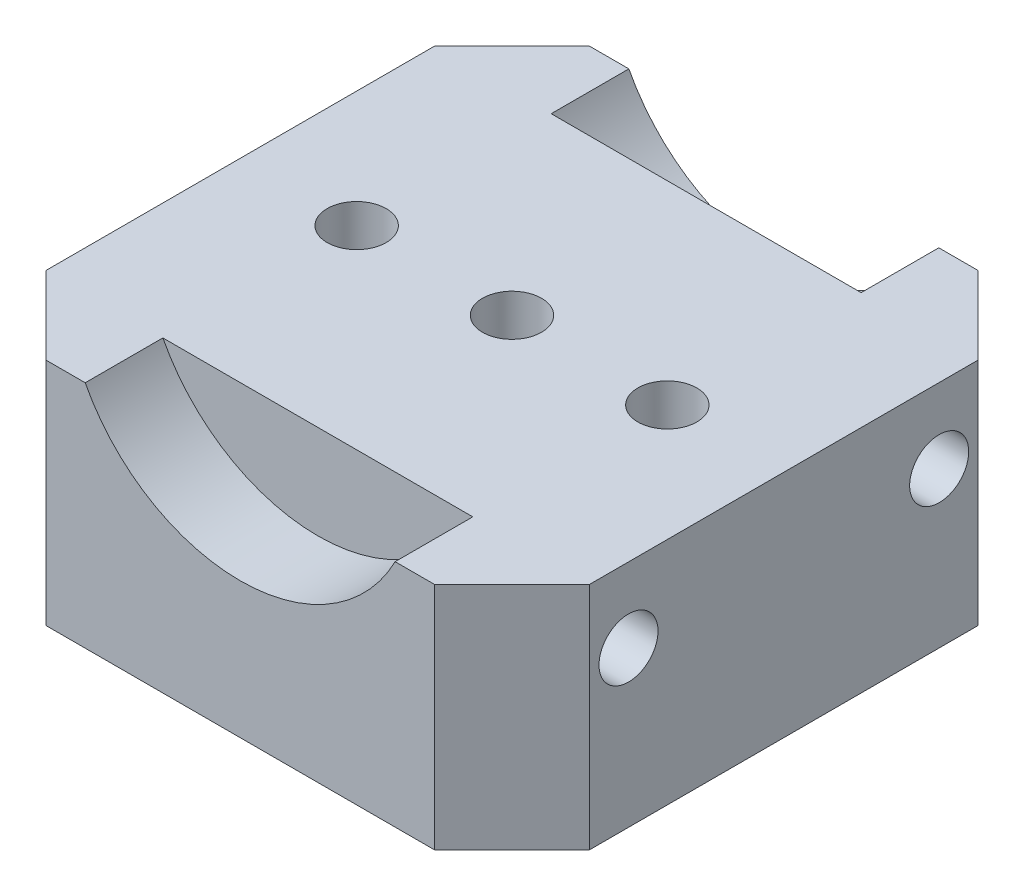
ISO-10303-21;
HEADER;
FILE_DESCRIPTION(('STEP AP214'),'2;1');
FILE_NAME('part.step','',(''),(''),'','','');
FILE_SCHEMA(('AUTOMOTIVE_DESIGN { 1 0 10303 214 1 1 1 1 }'));
ENDSEC;
DATA;
#1=APPLICATION_CONTEXT('core data for automotive mechanical design processes');
#2=APPLICATION_PROTOCOL_DEFINITION('international standard','automotive_design',2000,#1);
#3=PRODUCT_CONTEXT('',#1,'mechanical');
#4=PRODUCT('Part','Part','',(#3));
#5=PRODUCT_RELATED_PRODUCT_CATEGORY('part','',(#4));
#6=PRODUCT_DEFINITION_FORMATION('','',#4);
#7=PRODUCT_DEFINITION_CONTEXT('part definition',#1,'design');
#8=PRODUCT_DEFINITION('design','',#6,#7);
#9=PRODUCT_DEFINITION_SHAPE('','',#8);
#10=(LENGTH_UNIT() NAMED_UNIT(*) SI_UNIT(.MILLI.,.METRE.));
#11=(NAMED_UNIT(*) PLANE_ANGLE_UNIT() SI_UNIT($,.RADIAN.));
#12=(NAMED_UNIT(*) SI_UNIT($,.STERADIAN.) SOLID_ANGLE_UNIT());
#13=UNCERTAINTY_MEASURE_WITH_UNIT(LENGTH_MEASURE(1.E-05),#10,'distance_accuracy_value','');
#14=(GEOMETRIC_REPRESENTATION_CONTEXT(3) GLOBAL_UNCERTAINTY_ASSIGNED_CONTEXT((#13)) GLOBAL_UNIT_ASSIGNED_CONTEXT((#10,
#11,#12)) REPRESENTATION_CONTEXT('',''));
#15=CARTESIAN_POINT('',(0.,0.,0.));
#16=DIRECTION('',(0.,0.,1.));
#17=DIRECTION('',(1.,0.,0.));
#18=AXIS2_PLACEMENT_3D('',#15,#16,#17);
#19=CARTESIAN_POINT('',(0.,18.796,0.));
#20=DIRECTION('',(0.,-1.,0.));
#21=DIRECTION('',(0.,0.,-1.));
#22=AXIS2_PLACEMENT_3D('',#19,#20,#21);
#23=PLANE('',#22);
#24=CARTESIAN_POINT('',(34.925,18.796,-22.225));
#25=DIRECTION('',(0.,-1.,0.));
#26=DIRECTION('',(0.,0.,-1.));
#27=AXIS2_PLACEMENT_3D('',#24,#25,#26);
#28=CIRCLE('',#27,2.413);
#29=CARTESIAN_POINT('',(34.925,18.796,-24.638));
#30=VERTEX_POINT('',#29);
#31=EDGE_CURVE('E152',#30,#30,#28,.T.);
#32=ORIENTED_EDGE('',*,*,#31,.T.);
#33=EDGE_LOOP('',(#32));
#34=FACE_BOUND('',#33,.T.);
#35=CARTESIAN_POINT('',(22.225,18.796,-22.225));
#36=DIRECTION('',(0.,-1.,0.));
#37=DIRECTION('',(0.,0.,-1.));
#38=AXIS2_PLACEMENT_3D('',#35,#36,#37);
#39=CIRCLE('',#38,2.413);
#40=CARTESIAN_POINT('',(22.225,18.796,-24.638));
#41=VERTEX_POINT('',#40);
#42=EDGE_CURVE('E158',#41,#41,#39,.T.);
#43=ORIENTED_EDGE('',*,*,#42,.T.);
#44=EDGE_LOOP('',(#43));
#45=FACE_BOUND('',#44,.T.);
#46=CARTESIAN_POINT('',(9.525,18.796,-22.225));
#47=DIRECTION('',(0.,-1.,0.));
#48=DIRECTION('',(0.,0.,-1.));
#49=AXIS2_PLACEMENT_3D('',#46,#47,#48);
#50=CIRCLE('',#49,2.413);
#51=CARTESIAN_POINT('',(9.525,18.796,-24.638));
#52=VERTEX_POINT('',#51);
#53=EDGE_CURVE('E172',#52,#52,#50,.T.);
#54=ORIENTED_EDGE('',*,*,#53,.T.);
#55=EDGE_LOOP('',(#54));
#56=FACE_BOUND('',#55,.T.);
#57=DIRECTION('',(0.,0.,-1.));
#58=VECTOR('',#57,1.);
#59=CARTESIAN_POINT('',(9.55535753266888,18.796,-38.1));
#60=LINE('',#59,#58);
#61=CARTESIAN_POINT('',(9.55535753266888,18.796,-44.45));
#62=VERTEX_POINT('',#61);
#63=CARTESIAN_POINT('',(9.55535753266888,18.796,-38.1));
#64=VERTEX_POINT('',#63);
#65=EDGE_CURVE('E11',#62,#64,#60,.F.);
#66=ORIENTED_EDGE('',*,*,#65,.F.);
#67=DIRECTION('',(1.,0.,0.));
#68=VECTOR('',#67,1.);
#69=CARTESIAN_POINT('',(0.,18.796,-44.45));
#70=LINE('',#69,#68);
#71=CARTESIAN_POINT('',(6.35,18.796,-44.45));
#72=VERTEX_POINT('',#71);
#73=EDGE_CURVE('E144',#72,#62,#70,.T.);
#74=ORIENTED_EDGE('',*,*,#73,.F.);
#75=DIRECTION('',(0.707106781186547,0.,-0.707106781186548));
#76=VECTOR('',#75,1.);
#77=CARTESIAN_POINT('',(0.,18.796,-38.1));
#78=LINE('',#77,#76);
#79=CARTESIAN_POINT('',(0.,18.796,-38.1));
#80=VERTEX_POINT('',#79);
#81=EDGE_CURVE('E176',#80,#72,#78,.T.);
#82=ORIENTED_EDGE('',*,*,#81,.F.);
#83=DIRECTION('',(0.,0.,-1.));
#84=VECTOR('',#83,1.);
#85=CARTESIAN_POINT('',(0.,18.796,0.));
#86=LINE('',#85,#84);
#87=CARTESIAN_POINT('',(0.,18.796,-6.35));
#88=VERTEX_POINT('',#87);
#89=EDGE_CURVE('E308',#88,#80,#86,.T.);
#90=ORIENTED_EDGE('',*,*,#89,.F.);
#91=DIRECTION('',(-0.707106781186548,0.,-0.707106781186548));
#92=VECTOR('',#91,1.);
#93=CARTESIAN_POINT('',(0.,18.796,-6.35));
#94=LINE('',#93,#92);
#95=CARTESIAN_POINT('',(6.35,18.796,0.));
#96=VERTEX_POINT('',#95);
#97=EDGE_CURVE('E187',#96,#88,#94,.T.);
#98=ORIENTED_EDGE('',*,*,#97,.F.);
#99=DIRECTION('',(1.,0.,0.));
#100=VECTOR('',#99,1.);
#101=CARTESIAN_POINT('',(0.,18.796,0.));
#102=LINE('',#101,#100);
#103=CARTESIAN_POINT('',(9.55535753266888,18.796,0.));
#104=VERTEX_POINT('',#103);
#105=EDGE_CURVE('E160',#96,#104,#102,.T.);
#106=ORIENTED_EDGE('',*,*,#105,.T.);
#107=DIRECTION('',(0.,0.,1.));
#108=VECTOR('',#107,1.);
#109=CARTESIAN_POINT('',(9.55535753266888,18.796,-6.35));
#110=LINE('',#109,#108);
#111=CARTESIAN_POINT('',(9.55535753266888,18.796,-6.35));
#112=VERTEX_POINT('',#111);
#113=EDGE_CURVE('E276',#104,#112,#110,.F.);
#114=ORIENTED_EDGE('',*,*,#113,.T.);
#115=DIRECTION('',(-1.,0.,0.));
#116=VECTOR('',#115,1.);
#117=CARTESIAN_POINT('',(0.,18.796,-6.35));
#118=LINE('',#117,#116);
#119=CARTESIAN_POINT('',(34.8946424673311,18.796,-6.35));
#120=VERTEX_POINT('',#119);
#121=EDGE_CURVE('E272',#120,#112,#118,.T.);
#122=ORIENTED_EDGE('',*,*,#121,.F.);
#123=DIRECTION('',(0.,0.,1.));
#124=VECTOR('',#123,1.);
#125=CARTESIAN_POINT('',(34.8946424673311,18.796,-6.35));
#126=LINE('',#125,#124);
#127=CARTESIAN_POINT('',(34.8946424673311,18.796,0.));
#128=VERTEX_POINT('',#127);
#129=EDGE_CURVE('E280',#120,#128,#126,.T.);
#130=ORIENTED_EDGE('',*,*,#129,.T.);
#131=CARTESIAN_POINT('',(38.1,18.796,0.));
#132=VERTEX_POINT('',#131);
#133=EDGE_CURVE('E168',#128,#132,#102,.T.);
#134=ORIENTED_EDGE('',*,*,#133,.T.);
#135=DIRECTION('',(-0.707106781186548,0.,0.707106781186547));
#136=VECTOR('',#135,1.);
#137=CARTESIAN_POINT('',(38.1,18.796,0.));
#138=LINE('',#137,#136);
#139=CARTESIAN_POINT('',(44.45,18.796,-6.35));
#140=VERTEX_POINT('',#139);
#141=EDGE_CURVE('E183',#140,#132,#138,.T.);
#142=ORIENTED_EDGE('',*,*,#141,.F.);
#143=DIRECTION('',(0.,0.,-1.));
#144=VECTOR('',#143,1.);
#145=CARTESIAN_POINT('',(44.45,18.796,0.));
#146=LINE('',#145,#144);
#147=CARTESIAN_POINT('',(44.45,18.796,-38.1));
#148=VERTEX_POINT('',#147);
#149=EDGE_CURVE('E163',#140,#148,#146,.T.);
#150=ORIENTED_EDGE('',*,*,#149,.T.);
#151=DIRECTION('',(0.707106781186548,0.,0.707106781186548));
#152=VECTOR('',#151,1.);
#153=CARTESIAN_POINT('',(38.1,18.796,-44.45));
#154=LINE('',#153,#152);
#155=CARTESIAN_POINT('',(38.1,18.796,-44.45));
#156=VERTEX_POINT('',#155);
#157=EDGE_CURVE('E179',#156,#148,#154,.T.);
#158=ORIENTED_EDGE('',*,*,#157,.F.);
#159=CARTESIAN_POINT('',(34.8946424673311,18.796,-44.45));
#160=VERTEX_POINT('',#159);
#161=EDGE_CURVE('E153',#160,#156,#70,.T.);
#162=ORIENTED_EDGE('',*,*,#161,.F.);
#163=DIRECTION('',(0.,0.,-1.));
#164=VECTOR('',#163,1.);
#165=CARTESIAN_POINT('',(34.8946424673311,18.796,-38.1));
#166=LINE('',#165,#164);
#167=CARTESIAN_POINT('',(34.8946424673311,18.796,-38.1));
#168=VERTEX_POINT('',#167);
#169=EDGE_CURVE('E54',#168,#160,#166,.T.);
#170=ORIENTED_EDGE('',*,*,#169,.F.);
#171=DIRECTION('',(1.,0.,0.));
#172=VECTOR('',#171,1.);
#173=CARTESIAN_POINT('',(0.,18.796,-38.1));
#174=LINE('',#173,#172);
#175=EDGE_CURVE('E146',#64,#168,#174,.T.);
#176=ORIENTED_EDGE('',*,*,#175,.F.);
#177=EDGE_LOOP('',(#66,#74,#82,#90,#98,#106,#114,#122,#130,#134,#142,#150,#158,#162,#170,#176));
#178=FACE_BOUND('',#177,.T.);
#179=ADVANCED_FACE('F45',(#34,#45,#56,#178),#23,.F.);
#180=CARTESIAN_POINT('',(0.,0.,0.));
#181=DIRECTION('',(0.,-1.,0.));
#182=DIRECTION('',(0.,0.,-1.));
#183=AXIS2_PLACEMENT_3D('',#180,#181,#182);
#184=PLANE('',#183);
#185=CARTESIAN_POINT('',(22.225,0.,-22.225));
#186=DIRECTION('',(0.,1.,0.));
#187=DIRECTION('',(0.,0.,1.));
#188=AXIS2_PLACEMENT_3D('',#185,#186,#187);
#189=CIRCLE('',#188,2.413);
#190=CARTESIAN_POINT('',(22.225,0.,-19.812));
#191=VERTEX_POINT('',#190);
#192=EDGE_CURVE('E211',#191,#191,#189,.T.);
#193=ORIENTED_EDGE('',*,*,#192,.T.);
#194=EDGE_LOOP('',(#193));
#195=FACE_BOUND('',#194,.T.);
#196=DIRECTION('',(0.,0.,1.));
#197=VECTOR('',#196,1.);
#198=CARTESIAN_POINT('',(0.,0.,-6.35));
#199=LINE('',#198,#197);
#200=CARTESIAN_POINT('',(0.,0.,-38.1));
#201=VERTEX_POINT('',#200);
#202=CARTESIAN_POINT('',(0.,0.,-6.35));
#203=VERTEX_POINT('',#202);
#204=EDGE_CURVE('E219',#201,#203,#199,.T.);
#205=ORIENTED_EDGE('',*,*,#204,.F.);
#206=DIRECTION('',(-0.707106781186547,0.,0.707106781186548));
#207=VECTOR('',#206,1.);
#208=CARTESIAN_POINT('',(0.,0.,-38.1));
#209=LINE('',#208,#207);
#210=CARTESIAN_POINT('',(6.35,0.,-44.45));
#211=VERTEX_POINT('',#210);
#212=EDGE_CURVE('E246',#211,#201,#209,.T.);
#213=ORIENTED_EDGE('',*,*,#212,.F.);
#214=DIRECTION('',(-1.,0.,0.));
#215=VECTOR('',#214,1.);
#216=CARTESIAN_POINT('',(6.35,0.,-44.45));
#217=LINE('',#216,#215);
#218=CARTESIAN_POINT('',(38.1,0.,-44.45));
#219=VERTEX_POINT('',#218);
#220=EDGE_CURVE('E243',#219,#211,#217,.T.);
#221=ORIENTED_EDGE('',*,*,#220,.F.);
#222=DIRECTION('',(-0.707106781186547,0.,-0.707106781186547));
#223=VECTOR('',#222,1.);
#224=CARTESIAN_POINT('',(38.1,0.,-44.45));
#225=LINE('',#224,#223);
#226=CARTESIAN_POINT('',(44.45,0.,-38.1));
#227=VERTEX_POINT('',#226);
#228=EDGE_CURVE('E239',#227,#219,#225,.T.);
#229=ORIENTED_EDGE('',*,*,#228,.F.);
#230=DIRECTION('',(0.,0.,-1.));
#231=VECTOR('',#230,1.);
#232=CARTESIAN_POINT('',(44.45,0.,-6.35));
#233=LINE('',#232,#231);
#234=CARTESIAN_POINT('',(44.45,0.,-6.35));
#235=VERTEX_POINT('',#234);
#236=EDGE_CURVE('E235',#235,#227,#233,.T.);
#237=ORIENTED_EDGE('',*,*,#236,.F.);
#238=DIRECTION('',(0.707106781186548,0.,-0.707106781186547));
#239=VECTOR('',#238,1.);
#240=CARTESIAN_POINT('',(38.1,0.,0.));
#241=LINE('',#240,#239);
#242=CARTESIAN_POINT('',(38.1,0.,0.));
#243=VERTEX_POINT('',#242);
#244=EDGE_CURVE('E231',#243,#235,#241,.T.);
#245=ORIENTED_EDGE('',*,*,#244,.F.);
#246=DIRECTION('',(1.,0.,0.));
#247=VECTOR('',#246,1.);
#248=CARTESIAN_POINT('',(6.35,0.,0.));
#249=LINE('',#248,#247);
#250=CARTESIAN_POINT('',(6.35,0.,0.));
#251=VERTEX_POINT('',#250);
#252=EDGE_CURVE('E227',#251,#243,#249,.T.);
#253=ORIENTED_EDGE('',*,*,#252,.F.);
#254=DIRECTION('',(0.707106781186547,0.,0.707106781186547));
#255=VECTOR('',#254,1.);
#256=CARTESIAN_POINT('',(0.,0.,-6.35));
#257=LINE('',#256,#255);
#258=EDGE_CURVE('E223',#203,#251,#257,.T.);
#259=ORIENTED_EDGE('',*,*,#258,.F.);
#260=EDGE_LOOP('',(#205,#213,#221,#229,#237,#245,#253,#259));
#261=FACE_BOUND('',#260,.T.);
#262=CARTESIAN_POINT('',(9.525,0.,-22.225));
#263=DIRECTION('',(0.,1.,0.));
#264=DIRECTION('',(0.,0.,1.));
#265=AXIS2_PLACEMENT_3D('',#262,#263,#264);
#266=CIRCLE('',#265,2.413);
#267=CARTESIAN_POINT('',(9.525,0.,-19.812));
#268=VERTEX_POINT('',#267);
#269=EDGE_CURVE('E215',#268,#268,#266,.T.);
#270=ORIENTED_EDGE('',*,*,#269,.T.);
#271=EDGE_LOOP('',(#270));
#272=FACE_BOUND('',#271,.T.);
#273=CARTESIAN_POINT('',(34.925,0.,-22.225));
#274=DIRECTION('',(0.,1.,0.));
#275=DIRECTION('',(0.,0.,1.));
#276=AXIS2_PLACEMENT_3D('',#273,#274,#275);
#277=CIRCLE('',#276,2.413);
#278=CARTESIAN_POINT('',(34.925,0.,-19.812));
#279=VERTEX_POINT('',#278);
#280=EDGE_CURVE('E207',#279,#279,#277,.T.);
#281=ORIENTED_EDGE('',*,*,#280,.T.);
#282=EDGE_LOOP('',(#281));
#283=FACE_BOUND('',#282,.T.);
#284=ADVANCED_FACE('F301',(#195,#261,#272,#283),#184,.T.);
#285=CARTESIAN_POINT('',(0.,44.45,-6.35));
#286=DIRECTION('',(1.,0.,0.));
#287=DIRECTION('',(0.,0.,-1.));
#288=AXIS2_PLACEMENT_3D('',#285,#286,#287);
#289=PLANE('',#288);
#290=CARTESIAN_POINT('',(0.,12.7,-9.525));
#291=DIRECTION('',(1.,0.,0.));
#292=DIRECTION('',(0.,0.,-1.));
#293=AXIS2_PLACEMENT_3D('',#290,#291,#292);
#294=CIRCLE('',#293,2.413);
#295=CARTESIAN_POINT('',(0.,12.7,-11.938));
#296=VERTEX_POINT('',#295);
#297=EDGE_CURVE('E203',#296,#296,#294,.T.);
#298=ORIENTED_EDGE('',*,*,#297,.T.);
#299=EDGE_LOOP('',(#298));
#300=FACE_BOUND('',#299,.T.);
#301=CARTESIAN_POINT('',(0.,12.7,-34.925));
#302=DIRECTION('',(1.,0.,0.));
#303=DIRECTION('',(0.,0.,-1.));
#304=AXIS2_PLACEMENT_3D('',#301,#302,#303);
#305=CIRCLE('',#304,2.413);
#306=CARTESIAN_POINT('',(0.,12.7,-37.338));
#307=VERTEX_POINT('',#306);
#308=EDGE_CURVE('E196',#307,#307,#305,.T.);
#309=ORIENTED_EDGE('',*,*,#308,.T.);
#310=EDGE_LOOP('',(#309));
#311=FACE_BOUND('',#310,.T.);
#312=DIRECTION('',(0.,-1.,0.));
#313=VECTOR('',#312,1.);
#314=CARTESIAN_POINT('',(0.,44.45,-6.35));
#315=LINE('',#314,#313);
#316=EDGE_CURVE('E270',#88,#203,#315,.T.);
#317=ORIENTED_EDGE('',*,*,#316,.F.);
#318=ORIENTED_EDGE('',*,*,#89,.T.);
#319=DIRECTION('',(0.,-1.,0.));
#320=VECTOR('',#319,1.);
#321=CARTESIAN_POINT('',(0.,44.45,-38.1));
#322=LINE('',#321,#320);
#323=EDGE_CURVE('E250',#80,#201,#322,.T.);
#324=ORIENTED_EDGE('',*,*,#323,.T.);
#325=ORIENTED_EDGE('',*,*,#204,.T.);
#326=EDGE_LOOP('',(#317,#318,#324,#325));
#327=FACE_BOUND('',#326,.T.);
#328=ADVANCED_FACE('F47',(#300,#311,#327),#289,.F.);
#329=CARTESIAN_POINT('',(0.,44.45,-6.35));
#330=DIRECTION('',(0.707106781186547,0.,-0.707106781186547));
#331=DIRECTION('',(-0.707106781186548,0.,-0.707106781186548));
#332=AXIS2_PLACEMENT_3D('',#329,#330,#331);
#333=PLANE('',#332);
#334=DIRECTION('',(0.,-1.,0.));
#335=VECTOR('',#334,1.);
#336=CARTESIAN_POINT('',(6.35,44.45,0.));
#337=LINE('',#336,#335);
#338=EDGE_CURVE('E267',#96,#251,#337,.T.);
#339=ORIENTED_EDGE('',*,*,#338,.F.);
#340=ORIENTED_EDGE('',*,*,#97,.T.);
#341=ORIENTED_EDGE('',*,*,#316,.T.);
#342=ORIENTED_EDGE('',*,*,#258,.T.);
#343=EDGE_LOOP('',(#339,#340,#341,#342));
#344=FACE_BOUND('',#343,.T.);
#345=ADVANCED_FACE('F337',(#344),#333,.F.);
#346=CARTESIAN_POINT('',(6.35,44.45,0.));
#347=DIRECTION('',(0.,0.,-1.));
#348=DIRECTION('',(-1.,0.,0.));
#349=AXIS2_PLACEMENT_3D('',#346,#347,#348);
#350=PLANE('',#349);
#351=ORIENTED_EDGE('',*,*,#133,.F.);
#352=CARTESIAN_POINT('',(22.225,25.4,0.));
#353=DIRECTION('',(0.,0.,1.));
#354=DIRECTION('',(1.,0.,0.));
#355=AXIS2_PLACEMENT_3D('',#352,#353,#354);
#356=CIRCLE('',#355,14.2875);
#357=EDGE_CURVE('E288',#104,#128,#356,.T.);
#358=ORIENTED_EDGE('',*,*,#357,.F.);
#359=ORIENTED_EDGE('',*,*,#105,.F.);
#360=ORIENTED_EDGE('',*,*,#338,.T.);
#361=ORIENTED_EDGE('',*,*,#252,.T.);
#362=DIRECTION('',(0.,-1.,0.));
#363=VECTOR('',#362,1.);
#364=CARTESIAN_POINT('',(38.1,44.45,0.));
#365=LINE('',#364,#363);
#366=EDGE_CURVE('E264',#132,#243,#365,.T.);
#367=ORIENTED_EDGE('',*,*,#366,.F.);
#368=EDGE_LOOP('',(#351,#358,#359,#360,#361,#367));
#369=FACE_BOUND('',#368,.T.);
#370=ADVANCED_FACE('F326',(#369),#350,.F.);
#371=CARTESIAN_POINT('',(38.1,44.45,0.));
#372=DIRECTION('',(-0.707106781186547,0.,-0.707106781186548));
#373=DIRECTION('',(-0.707106781186548,0.,0.707106781186547));
#374=AXIS2_PLACEMENT_3D('',#371,#372,#373);
#375=PLANE('',#374);
#376=DIRECTION('',(0.,-1.,0.));
#377=VECTOR('',#376,1.);
#378=CARTESIAN_POINT('',(44.45,44.45,-6.35));
#379=LINE('',#378,#377);
#380=EDGE_CURVE('E261',#140,#235,#379,.T.);
#381=ORIENTED_EDGE('',*,*,#380,.F.);
#382=ORIENTED_EDGE('',*,*,#141,.T.);
#383=ORIENTED_EDGE('',*,*,#366,.T.);
#384=ORIENTED_EDGE('',*,*,#244,.T.);
#385=EDGE_LOOP('',(#381,#382,#383,#384));
#386=FACE_BOUND('',#385,.T.);
#387=ADVANCED_FACE('F331',(#386),#375,.F.);
#388=CARTESIAN_POINT('',(44.45,44.45,-6.35));
#389=DIRECTION('',(-1.,0.,0.));
#390=DIRECTION('',(0.,0.,1.));
#391=AXIS2_PLACEMENT_3D('',#388,#389,#390);
#392=PLANE('',#391);
#393=CARTESIAN_POINT('',(44.45,12.7,-9.525));
#394=DIRECTION('',(1.,0.,0.));
#395=DIRECTION('',(0.,0.,-1.));
#396=AXIS2_PLACEMENT_3D('',#393,#394,#395);
#397=CIRCLE('',#396,2.413);
#398=CARTESIAN_POINT('',(44.45,12.7,-11.938));
#399=VERTEX_POINT('',#398);
#400=EDGE_CURVE('E191',#399,#399,#397,.T.);
#401=ORIENTED_EDGE('',*,*,#400,.F.);
#402=EDGE_LOOP('',(#401));
#403=FACE_BOUND('',#402,.T.);
#404=CARTESIAN_POINT('',(44.45,12.7,-34.925));
#405=DIRECTION('',(1.,0.,0.));
#406=DIRECTION('',(0.,0.,-1.));
#407=AXIS2_PLACEMENT_3D('',#404,#405,#406);
#408=CIRCLE('',#407,2.413);
#409=CARTESIAN_POINT('',(44.45,12.7,-37.338));
#410=VERTEX_POINT('',#409);
#411=EDGE_CURVE('E192',#410,#410,#408,.T.);
#412=ORIENTED_EDGE('',*,*,#411,.F.);
#413=EDGE_LOOP('',(#412));
#414=FACE_BOUND('',#413,.T.);
#415=DIRECTION('',(0.,-1.,0.));
#416=VECTOR('',#415,1.);
#417=CARTESIAN_POINT('',(44.45,44.45,-38.1));
#418=LINE('',#417,#416);
#419=EDGE_CURVE('E258',#148,#227,#418,.T.);
#420=ORIENTED_EDGE('',*,*,#419,.F.);
#421=ORIENTED_EDGE('',*,*,#149,.F.);
#422=ORIENTED_EDGE('',*,*,#380,.T.);
#423=ORIENTED_EDGE('',*,*,#236,.T.);
#424=EDGE_LOOP('',(#420,#421,#422,#423));
#425=FACE_BOUND('',#424,.T.);
#426=ADVANCED_FACE('F334',(#403,#414,#425),#392,.F.);
#427=CARTESIAN_POINT('',(38.1,44.45,-44.45));
#428=DIRECTION('',(-0.707106781186547,0.,0.707106781186547));
#429=DIRECTION('',(0.707106781186548,0.,0.707106781186548));
#430=AXIS2_PLACEMENT_3D('',#427,#428,#429);
#431=PLANE('',#430);
#432=DIRECTION('',(0.,-1.,0.));
#433=VECTOR('',#432,1.);
#434=CARTESIAN_POINT('',(38.1,44.45,-44.45));
#435=LINE('',#434,#433);
#436=EDGE_CURVE('E255',#156,#219,#435,.T.);
#437=ORIENTED_EDGE('',*,*,#436,.F.);
#438=ORIENTED_EDGE('',*,*,#157,.T.);
#439=ORIENTED_EDGE('',*,*,#419,.T.);
#440=ORIENTED_EDGE('',*,*,#228,.T.);
#441=EDGE_LOOP('',(#437,#438,#439,#440));
#442=FACE_BOUND('',#441,.T.);
#443=ADVANCED_FACE('F296',(#442),#431,.F.);
#444=CARTESIAN_POINT('',(6.35,44.45,-44.45));
#445=DIRECTION('',(0.,0.,1.));
#446=DIRECTION('',(1.,0.,0.));
#447=AXIS2_PLACEMENT_3D('',#444,#445,#446);
#448=PLANE('',#447);
#449=CARTESIAN_POINT('',(22.225,25.4,-44.45));
#450=DIRECTION('',(0.,0.,1.));
#451=DIRECTION('',(1.,0.,0.));
#452=AXIS2_PLACEMENT_3D('',#449,#450,#451);
#453=CIRCLE('',#452,14.2875);
#454=EDGE_CURVE('E133',#62,#160,#453,.T.);
#455=ORIENTED_EDGE('',*,*,#454,.T.);
#456=ORIENTED_EDGE('',*,*,#161,.T.);
#457=ORIENTED_EDGE('',*,*,#436,.T.);
#458=ORIENTED_EDGE('',*,*,#220,.T.);
#459=DIRECTION('',(0.,-1.,0.));
#460=VECTOR('',#459,1.);
#461=CARTESIAN_POINT('',(6.35,44.45,-44.45));
#462=LINE('',#461,#460);
#463=EDGE_CURVE('E150',#72,#211,#462,.T.);
#464=ORIENTED_EDGE('',*,*,#463,.F.);
#465=ORIENTED_EDGE('',*,*,#73,.T.);
#466=EDGE_LOOP('',(#455,#456,#457,#458,#464,#465));
#467=FACE_BOUND('',#466,.T.);
#468=ADVANCED_FACE('F148',(#467),#448,.F.);
#469=CARTESIAN_POINT('',(0.,44.45,-38.1));
#470=DIRECTION('',(0.707106781186548,0.,0.707106781186547));
#471=DIRECTION('',(0.707106781186547,0.,-0.707106781186548));
#472=AXIS2_PLACEMENT_3D('',#469,#470,#471);
#473=PLANE('',#472);
#474=ORIENTED_EDGE('',*,*,#323,.F.);
#475=ORIENTED_EDGE('',*,*,#81,.T.);
#476=ORIENTED_EDGE('',*,*,#463,.T.);
#477=ORIENTED_EDGE('',*,*,#212,.T.);
#478=EDGE_LOOP('',(#474,#475,#476,#477));
#479=FACE_BOUND('',#478,.T.);
#480=ADVANCED_FACE('F306',(#479),#473,.F.);
#481=CARTESIAN_POINT('',(9.525,44.45,-22.225));
#482=DIRECTION('',(0.,-1.,0.));
#483=DIRECTION('',(0.,0.,-1.));
#484=AXIS2_PLACEMENT_3D('',#481,#482,#483);
#485=CYLINDRICAL_SURFACE('',#484,2.413);
#486=ORIENTED_EDGE('',*,*,#53,.F.);
#487=EDGE_LOOP('',(#486));
#488=FACE_BOUND('',#487,.T.);
#489=ORIENTED_EDGE('',*,*,#269,.F.);
#490=EDGE_LOOP('',(#489));
#491=FACE_BOUND('',#490,.T.);
#492=ADVANCED_FACE('F375',(#488,#491),#485,.F.);
#493=CARTESIAN_POINT('',(22.225,44.45,-22.225));
#494=DIRECTION('',(0.,-1.,0.));
#495=DIRECTION('',(0.,0.,-1.));
#496=AXIS2_PLACEMENT_3D('',#493,#494,#495);
#497=CYLINDRICAL_SURFACE('',#496,2.413);
#498=ORIENTED_EDGE('',*,*,#42,.F.);
#499=EDGE_LOOP('',(#498));
#500=FACE_BOUND('',#499,.T.);
#501=ORIENTED_EDGE('',*,*,#192,.F.);
#502=EDGE_LOOP('',(#501));
#503=FACE_BOUND('',#502,.T.);
#504=ADVANCED_FACE('F371',(#500,#503),#497,.F.);
#505=CARTESIAN_POINT('',(34.925,44.45,-22.225));
#506=DIRECTION('',(0.,-1.,0.));
#507=DIRECTION('',(0.,0.,-1.));
#508=AXIS2_PLACEMENT_3D('',#505,#506,#507);
#509=CYLINDRICAL_SURFACE('',#508,2.413);
#510=ORIENTED_EDGE('',*,*,#31,.F.);
#511=EDGE_LOOP('',(#510));
#512=FACE_BOUND('',#511,.T.);
#513=ORIENTED_EDGE('',*,*,#280,.F.);
#514=EDGE_LOOP('',(#513));
#515=FACE_BOUND('',#514,.T.);
#516=ADVANCED_FACE('F364',(#512,#515),#509,.F.);
#517=CARTESIAN_POINT('',(-6.35,12.7,-34.925));
#518=DIRECTION('',(1.,0.,0.));
#519=DIRECTION('',(0.,0.,-1.));
#520=AXIS2_PLACEMENT_3D('',#517,#518,#519);
#521=CYLINDRICAL_SURFACE('',#520,2.413);
#522=ORIENTED_EDGE('',*,*,#411,.T.);
#523=EDGE_LOOP('',(#522));
#524=FACE_BOUND('',#523,.T.);
#525=ORIENTED_EDGE('',*,*,#308,.F.);
#526=EDGE_LOOP('',(#525));
#527=FACE_BOUND('',#526,.T.);
#528=ADVANCED_FACE('F360',(#524,#527),#521,.F.);
#529=CARTESIAN_POINT('',(-6.35,12.7,-9.525));
#530=DIRECTION('',(1.,0.,0.));
#531=DIRECTION('',(0.,0.,-1.));
#532=AXIS2_PLACEMENT_3D('',#529,#530,#531);
#533=CYLINDRICAL_SURFACE('',#532,2.413);
#534=ORIENTED_EDGE('',*,*,#400,.T.);
#535=EDGE_LOOP('',(#534));
#536=FACE_BOUND('',#535,.T.);
#537=ORIENTED_EDGE('',*,*,#297,.F.);
#538=EDGE_LOOP('',(#537));
#539=FACE_BOUND('',#538,.T.);
#540=ADVANCED_FACE('F363',(#536,#539),#533,.F.);
#541=CARTESIAN_POINT('',(22.225,25.4,-6.35));
#542=DIRECTION('',(0.,0.,1.));
#543=DIRECTION('',(1.,0.,0.));
#544=AXIS2_PLACEMENT_3D('',#541,#542,#543);
#545=CYLINDRICAL_SURFACE('',#544,14.2875);
#546=CARTESIAN_POINT('',(22.225,25.4,-6.35));
#547=DIRECTION('',(0.,0.,1.));
#548=DIRECTION('',(1.,0.,0.));
#549=AXIS2_PLACEMENT_3D('',#546,#547,#548);
#550=CIRCLE('',#549,14.2875);
#551=EDGE_CURVE('E66',#112,#120,#550,.T.);
#552=ORIENTED_EDGE('',*,*,#551,.F.);
#553=ORIENTED_EDGE('',*,*,#113,.F.);
#554=ORIENTED_EDGE('',*,*,#357,.T.);
#555=ORIENTED_EDGE('',*,*,#129,.F.);
#556=EDGE_LOOP('',(#552,#553,#554,#555));
#557=FACE_BOUND('',#556,.T.);
#558=ADVANCED_FACE('F320',(#557),#545,.F.);
#559=CARTESIAN_POINT('',(22.225,25.4,-6.35));
#560=DIRECTION('',(0.,0.,1.));
#561=DIRECTION('',(1.,0.,0.));
#562=AXIS2_PLACEMENT_3D('',#559,#560,#561);
#563=PLANE('',#562);
#564=ORIENTED_EDGE('',*,*,#121,.T.);
#565=ORIENTED_EDGE('',*,*,#551,.T.);
#566=EDGE_LOOP('',(#564,#565));
#567=FACE_BOUND('',#566,.T.);
#568=ADVANCED_FACE('F433',(#567),#563,.T.);
#569=CARTESIAN_POINT('',(22.225,25.4,-38.1));
#570=DIRECTION('',(0.,0.,-1.));
#571=DIRECTION('',(-1.,0.,0.));
#572=AXIS2_PLACEMENT_3D('',#569,#570,#571);
#573=CYLINDRICAL_SURFACE('',#572,14.2875);
#574=ORIENTED_EDGE('',*,*,#65,.T.);
#575=CARTESIAN_POINT('',(22.225,25.4,-38.1));
#576=DIRECTION('',(0.,0.,1.));
#577=DIRECTION('',(1.,0.,0.));
#578=AXIS2_PLACEMENT_3D('',#575,#576,#577);
#579=CIRCLE('',#578,14.2875);
#580=EDGE_CURVE('E60',#64,#168,#579,.T.);
#581=ORIENTED_EDGE('',*,*,#580,.T.);
#582=ORIENTED_EDGE('',*,*,#169,.T.);
#583=ORIENTED_EDGE('',*,*,#454,.F.);
#584=EDGE_LOOP('',(#574,#581,#582,#583));
#585=FACE_BOUND('',#584,.T.);
#586=ADVANCED_FACE('F135',(#585),#573,.F.);
#587=CARTESIAN_POINT('',(22.225,25.4,-38.1));
#588=DIRECTION('',(0.,0.,-1.));
#589=DIRECTION('',(1.,0.,0.));
#590=AXIS2_PLACEMENT_3D('',#587,#588,#589);
#591=PLANE('',#590);
#592=ORIENTED_EDGE('',*,*,#175,.T.);
#593=ORIENTED_EDGE('',*,*,#580,.F.);
#594=EDGE_LOOP('',(#592,#593));
#595=FACE_BOUND('',#594,.T.);
#596=ADVANCED_FACE('F286',(#595),#591,.T.);
#597=CLOSED_SHELL('',(#179,#284,#328,#345,#370,#387,#426,#443,#468,#480,#492,#504,#516,#528,
#540,#558,#568,#586,#596));
#598=MANIFOLD_SOLID_BREP('B2',#597);
#599=ADVANCED_BREP_SHAPE_REPRESENTATION('',(#18,#598),#14);
#600=SHAPE_DEFINITION_REPRESENTATION(#9,#599);
ENDSEC;
END-ISO-10303-21;
